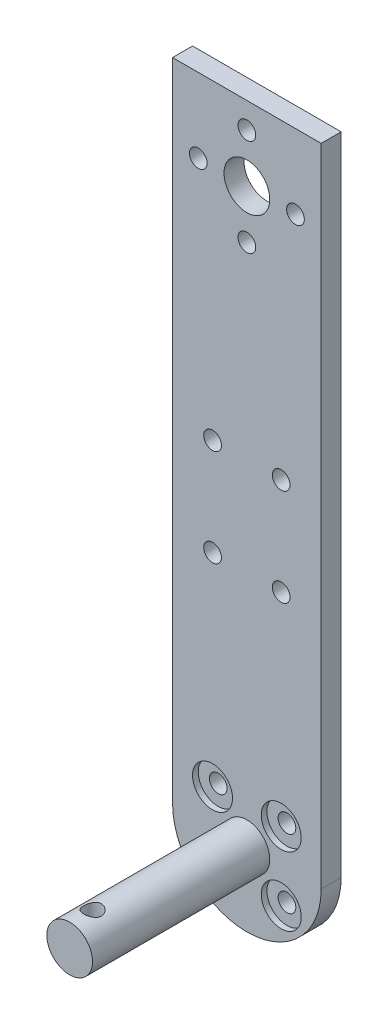
ISO-10303-21;
HEADER;
FILE_DESCRIPTION(('STEP AP214'),'2;1');
FILE_NAME('part.step','',(''),(''),'','','');
FILE_SCHEMA(('AUTOMOTIVE_DESIGN { 1 0 10303 214 1 1 1 1 }'));
ENDSEC;
DATA;
#1=APPLICATION_CONTEXT('core data for automotive mechanical design processes');
#2=APPLICATION_PROTOCOL_DEFINITION('international standard','automotive_design',2000,#1);
#3=PRODUCT_CONTEXT('',#1,'mechanical');
#4=PRODUCT('Part','Part','',(#3));
#5=PRODUCT_RELATED_PRODUCT_CATEGORY('part','',(#4));
#6=PRODUCT_DEFINITION_FORMATION('','',#4);
#7=PRODUCT_DEFINITION_CONTEXT('part definition',#1,'design');
#8=PRODUCT_DEFINITION('design','',#6,#7);
#9=PRODUCT_DEFINITION_SHAPE('','',#8);
#10=(LENGTH_UNIT() NAMED_UNIT(*) SI_UNIT(.MILLI.,.METRE.));
#11=(NAMED_UNIT(*) PLANE_ANGLE_UNIT() SI_UNIT($,.RADIAN.));
#12=(NAMED_UNIT(*) SI_UNIT($,.STERADIAN.) SOLID_ANGLE_UNIT());
#13=UNCERTAINTY_MEASURE_WITH_UNIT(LENGTH_MEASURE(1.E-05),#10,'distance_accuracy_value','');
#14=(GEOMETRIC_REPRESENTATION_CONTEXT(3) GLOBAL_UNCERTAINTY_ASSIGNED_CONTEXT((#13)) GLOBAL_UNIT_ASSIGNED_CONTEXT((#10,
#11,#12)) REPRESENTATION_CONTEXT('',''));
#15=CARTESIAN_POINT('',(0.,0.,0.));
#16=DIRECTION('',(0.,0.,1.));
#17=DIRECTION('',(1.,0.,0.));
#18=AXIS2_PLACEMENT_3D('',#15,#16,#17);
#19=CARTESIAN_POINT('',(6.01040764008564,6.01040764008567,3.5));
#20=DIRECTION('',(0.,0.,-1.));
#21=DIRECTION('',(-1.,0.,0.));
#22=AXIS2_PLACEMENT_3D('',#19,#20,#21);
#23=CYLINDRICAL_SURFACE('',#22,1.55);
#24=CARTESIAN_POINT('',(6.01040764008564,6.01040764008567,0.));
#25=DIRECTION('',(0.,0.,1.));
#26=DIRECTION('',(1.,0.,0.));
#27=AXIS2_PLACEMENT_3D('',#24,#25,#26);
#28=CIRCLE('',#27,1.55);
#29=CARTESIAN_POINT('',(7.56040764008564,6.01040764008567,0.));
#30=VERTEX_POINT('',#29);
#31=EDGE_CURVE('E109',#30,#30,#28,.T.);
#32=ORIENTED_EDGE('',*,*,#31,.F.);
#33=EDGE_LOOP('',(#32));
#34=FACE_BOUND('',#33,.T.);
#35=CARTESIAN_POINT('',(6.01040764008564,6.01040764008567,2.5));
#36=DIRECTION('',(0.,0.,1.));
#37=DIRECTION('',(1.,0.,0.));
#38=AXIS2_PLACEMENT_3D('',#35,#36,#37);
#39=CIRCLE('',#38,1.55);
#40=CARTESIAN_POINT('',(7.56040764008564,6.01040764008567,2.5));
#41=VERTEX_POINT('',#40);
#42=EDGE_CURVE('E40',#41,#41,#39,.T.);
#43=ORIENTED_EDGE('',*,*,#42,.T.);
#44=EDGE_LOOP('',(#43));
#45=FACE_BOUND('',#44,.T.);
#46=ADVANCED_FACE('F36',(#34,#45),#23,.F.);
#47=CARTESIAN_POINT('',(6.01040764008586,-6.01040764008564,3.5));
#48=DIRECTION('',(0.,0.,-1.));
#49=DIRECTION('',(-1.,0.,0.));
#50=AXIS2_PLACEMENT_3D('',#47,#48,#49);
#51=CYLINDRICAL_SURFACE('',#50,1.55);
#52=CARTESIAN_POINT('',(6.01040764008586,-6.01040764008564,0.));
#53=DIRECTION('',(0.,0.,1.));
#54=DIRECTION('',(1.,0.,0.));
#55=AXIS2_PLACEMENT_3D('',#52,#53,#54);
#56=CIRCLE('',#55,1.55);
#57=CARTESIAN_POINT('',(7.56040764008586,-6.01040764008564,0.));
#58=VERTEX_POINT('',#57);
#59=EDGE_CURVE('E192',#58,#58,#56,.T.);
#60=ORIENTED_EDGE('',*,*,#59,.F.);
#61=EDGE_LOOP('',(#60));
#62=FACE_BOUND('',#61,.T.);
#63=CARTESIAN_POINT('',(6.01040764008586,-6.01040764008564,2.5));
#64=DIRECTION('',(0.,0.,1.));
#65=DIRECTION('',(1.,0.,0.));
#66=AXIS2_PLACEMENT_3D('',#63,#64,#65);
#67=CIRCLE('',#66,1.55);
#68=CARTESIAN_POINT('',(7.56040764008586,-6.01040764008564,2.5));
#69=VERTEX_POINT('',#68);
#70=EDGE_CURVE('E122',#69,#69,#67,.T.);
#71=ORIENTED_EDGE('',*,*,#70,.T.);
#72=EDGE_LOOP('',(#71));
#73=FACE_BOUND('',#72,.T.);
#74=ADVANCED_FACE('F208',(#62,#73),#51,.F.);
#75=CARTESIAN_POINT('',(-6.01040764008545,-6.01040764008586,3.5));
#76=DIRECTION('',(0.,0.,-1.));
#77=DIRECTION('',(-1.,0.,0.));
#78=AXIS2_PLACEMENT_3D('',#75,#76,#77);
#79=CYLINDRICAL_SURFACE('',#78,1.55);
#80=CARTESIAN_POINT('',(-6.01040764008545,-6.01040764008586,0.));
#81=DIRECTION('',(0.,0.,1.));
#82=DIRECTION('',(1.,0.,0.));
#83=AXIS2_PLACEMENT_3D('',#80,#81,#82);
#84=CIRCLE('',#83,1.55);
#85=CARTESIAN_POINT('',(-4.46040764008545,-6.01040764008586,0.));
#86=VERTEX_POINT('',#85);
#87=EDGE_CURVE('E189',#86,#86,#84,.T.);
#88=ORIENTED_EDGE('',*,*,#87,.F.);
#89=EDGE_LOOP('',(#88));
#90=FACE_BOUND('',#89,.T.);
#91=CARTESIAN_POINT('',(-6.01040764008545,-6.01040764008586,2.5));
#92=DIRECTION('',(0.,0.,1.));
#93=DIRECTION('',(1.,0.,0.));
#94=AXIS2_PLACEMENT_3D('',#91,#92,#93);
#95=CIRCLE('',#94,1.55);
#96=CARTESIAN_POINT('',(-4.46040764008545,-6.01040764008586,2.5));
#97=VERTEX_POINT('',#96);
#98=EDGE_CURVE('E119',#97,#97,#95,.T.);
#99=ORIENTED_EDGE('',*,*,#98,.T.);
#100=EDGE_LOOP('',(#99));
#101=FACE_BOUND('',#100,.T.);
#102=ADVANCED_FACE('F213',(#90,#101),#79,.F.);
#103=CARTESIAN_POINT('',(-6.01040764008567,6.01040764008545,3.5));
#104=DIRECTION('',(0.,0.,-1.));
#105=DIRECTION('',(-1.,0.,0.));
#106=AXIS2_PLACEMENT_3D('',#103,#104,#105);
#107=CYLINDRICAL_SURFACE('',#106,1.55);
#108=CARTESIAN_POINT('',(-6.01040764008567,6.01040764008545,0.));
#109=DIRECTION('',(0.,0.,1.));
#110=DIRECTION('',(1.,0.,0.));
#111=AXIS2_PLACEMENT_3D('',#108,#109,#110);
#112=CIRCLE('',#111,1.55);
#113=CARTESIAN_POINT('',(-4.46040764008567,6.01040764008545,0.));
#114=VERTEX_POINT('',#113);
#115=EDGE_CURVE('E184',#114,#114,#112,.T.);
#116=ORIENTED_EDGE('',*,*,#115,.F.);
#117=EDGE_LOOP('',(#116));
#118=FACE_BOUND('',#117,.T.);
#119=CARTESIAN_POINT('',(-6.01040764008567,6.01040764008545,2.5));
#120=DIRECTION('',(0.,0.,1.));
#121=DIRECTION('',(1.,0.,0.));
#122=AXIS2_PLACEMENT_3D('',#119,#120,#121);
#123=CIRCLE('',#122,1.55);
#124=CARTESIAN_POINT('',(-4.46040764008567,6.01040764008545,2.5));
#125=VERTEX_POINT('',#124);
#126=EDGE_CURVE('E116',#125,#125,#123,.T.);
#127=ORIENTED_EDGE('',*,*,#126,.T.);
#128=EDGE_LOOP('',(#127));
#129=FACE_BOUND('',#128,.T.);
#130=ADVANCED_FACE('F221',(#118,#129),#107,.F.);
#131=CARTESIAN_POINT('',(0.,0.,3.5));
#132=DIRECTION('',(0.,0.,-1.));
#133=DIRECTION('',(-1.,0.,0.));
#134=AXIS2_PLACEMENT_3D('',#131,#132,#133);
#135=PLANE('',#134);
#136=CARTESIAN_POINT('',(-6.0104076400851,-6.01040764008567,3.5));
#137=DIRECTION('',(0.,0.,1.));
#138=DIRECTION('',(1.,0.,0.));
#139=AXIS2_PLACEMENT_3D('',#136,#137,#138);
#140=CIRCLE('',#139,3.50000000000018);
#141=CARTESIAN_POINT('',(-2.51040764008492,-6.01040764008567,3.5));
#142=VERTEX_POINT('',#141);
#143=EDGE_CURVE('E446',#142,#142,#140,.T.);
#144=ORIENTED_EDGE('',*,*,#143,.F.);
#145=EDGE_LOOP('',(#144));
#146=FACE_BOUND('',#145,.T.);
#147=CARTESIAN_POINT('',(6.01040764008601,-6.0104076400851,3.5));
#148=DIRECTION('',(0.,0.,1.));
#149=DIRECTION('',(1.,0.,0.));
#150=AXIS2_PLACEMENT_3D('',#147,#148,#149);
#151=CIRCLE('',#150,3.50000000000048);
#152=CARTESIAN_POINT('',(9.5104076400865,-6.0104076400851,3.5));
#153=VERTEX_POINT('',#152);
#154=EDGE_CURVE('E445',#153,#153,#151,.T.);
#155=ORIENTED_EDGE('',*,*,#154,.F.);
#156=EDGE_LOOP('',(#155));
#157=FACE_BOUND('',#156,.T.);
#158=CARTESIAN_POINT('',(6.01040764008545,6.01040764008601,3.5));
#159=DIRECTION('',(0.,0.,1.));
#160=DIRECTION('',(1.,0.,0.));
#161=AXIS2_PLACEMENT_3D('',#158,#159,#160);
#162=CIRCLE('',#161,3.50000000000036);
#163=CARTESIAN_POINT('',(9.5104076400858,6.01040764008601,3.5));
#164=VERTEX_POINT('',#163);
#165=EDGE_CURVE('E463',#164,#164,#162,.T.);
#166=ORIENTED_EDGE('',*,*,#165,.F.);
#167=EDGE_LOOP('',(#166));
#168=FACE_BOUND('',#167,.T.);
#169=CARTESIAN_POINT('',(-6.01040764008567,6.01040764008545,3.5));
#170=DIRECTION('',(0.,0.,1.));
#171=DIRECTION('',(1.,0.,0.));
#172=AXIS2_PLACEMENT_3D('',#169,#170,#171);
#173=CIRCLE('',#172,3.5);
#174=CARTESIAN_POINT('',(-2.51040764008567,6.01040764008545,3.5));
#175=VERTEX_POINT('',#174);
#176=EDGE_CURVE('E140',#175,#175,#173,.T.);
#177=ORIENTED_EDGE('',*,*,#176,.F.);
#178=EDGE_LOOP('',(#177));
#179=FACE_BOUND('',#178,.T.);
#180=CARTESIAN_POINT('',(0.,0.,3.5));
#181=DIRECTION('',(0.,0.,-1.));
#182=DIRECTION('',(-1.,0.,0.));
#183=AXIS2_PLACEMENT_3D('',#180,#181,#182);
#184=CIRCLE('',#183,4.);
#185=CARTESIAN_POINT('',(-4.,0.,3.5));
#186=VERTEX_POINT('',#185);
#187=EDGE_CURVE('E11',#186,#186,#184,.F.);
#188=ORIENTED_EDGE('',*,*,#187,.F.);
#189=EDGE_LOOP('',(#188));
#190=FACE_BOUND('',#189,.T.);
#191=CARTESIAN_POINT('',(0.,0.,3.5));
#192=DIRECTION('',(0.,0.,1.));
#193=DIRECTION('',(-1.,0.,0.));
#194=AXIS2_PLACEMENT_3D('',#191,#192,#193);
#195=CIRCLE('',#194,13.);
#196=CARTESIAN_POINT('',(-13.,0.,3.5));
#197=VERTEX_POINT('',#196);
#198=CARTESIAN_POINT('',(13.,0.,3.5));
#199=VERTEX_POINT('',#198);
#200=EDGE_CURVE('E92',#197,#199,#195,.T.);
#201=ORIENTED_EDGE('',*,*,#200,.T.);
#202=DIRECTION('',(0.,1.,0.));
#203=VECTOR('',#202,1.);
#204=CARTESIAN_POINT('',(13.,0.,3.5));
#205=LINE('',#204,#203);
#206=CARTESIAN_POINT('',(13.,113.,3.5));
#207=VERTEX_POINT('',#206);
#208=EDGE_CURVE('E86',#199,#207,#205,.T.);
#209=ORIENTED_EDGE('',*,*,#208,.T.);
#210=DIRECTION('',(-1.,0.,0.));
#211=VECTOR('',#210,1.);
#212=CARTESIAN_POINT('',(13.,113.,3.5));
#213=LINE('',#212,#211);
#214=CARTESIAN_POINT('',(-13.,113.,3.5));
#215=VERTEX_POINT('',#214);
#216=EDGE_CURVE('E90',#207,#215,#213,.T.);
#217=ORIENTED_EDGE('',*,*,#216,.T.);
#218=DIRECTION('',(0.,-1.,0.));
#219=VECTOR('',#218,1.);
#220=CARTESIAN_POINT('',(-13.,0.,3.5));
#221=LINE('',#220,#219);
#222=EDGE_CURVE('E55',#215,#197,#221,.T.);
#223=ORIENTED_EDGE('',*,*,#222,.T.);
#224=EDGE_LOOP('',(#201,#209,#217,#223));
#225=FACE_BOUND('',#224,.T.);
#226=CARTESIAN_POINT('',(0.,100.,3.5));
#227=DIRECTION('',(0.,0.,1.));
#228=DIRECTION('',(1.,0.,0.));
#229=AXIS2_PLACEMENT_3D('',#226,#227,#228);
#230=CIRCLE('',#229,4.);
#231=CARTESIAN_POINT('',(4.,100.,3.5));
#232=VERTEX_POINT('',#231);
#233=EDGE_CURVE('E196',#232,#232,#230,.T.);
#234=ORIENTED_EDGE('',*,*,#233,.F.);
#235=EDGE_LOOP('',(#234));
#236=FACE_BOUND('',#235,.T.);
#237=CARTESIAN_POINT('',(0.,108.5,3.5));
#238=DIRECTION('',(0.,0.,1.));
#239=DIRECTION('',(1.,0.,0.));
#240=AXIS2_PLACEMENT_3D('',#237,#238,#239);
#241=CIRCLE('',#240,1.55);
#242=CARTESIAN_POINT('',(1.55,108.5,3.5));
#243=VERTEX_POINT('',#242);
#244=EDGE_CURVE('E181',#243,#243,#241,.T.);
#245=ORIENTED_EDGE('',*,*,#244,.F.);
#246=EDGE_LOOP('',(#245));
#247=FACE_BOUND('',#246,.T.);
#248=CARTESIAN_POINT('',(6.,58.5,3.5));
#249=DIRECTION('',(0.,0.,1.));
#250=DIRECTION('',(1.,0.,0.));
#251=AXIS2_PLACEMENT_3D('',#248,#249,#250);
#252=CIRCLE('',#251,1.55);
#253=CARTESIAN_POINT('',(7.55,58.5,3.5));
#254=VERTEX_POINT('',#253);
#255=EDGE_CURVE('E175',#254,#254,#252,.T.);
#256=ORIENTED_EDGE('',*,*,#255,.F.);
#257=EDGE_LOOP('',(#256));
#258=FACE_BOUND('',#257,.T.);
#259=CARTESIAN_POINT('',(8.50000000000013,100.,3.5));
#260=DIRECTION('',(0.,0.,1.));
#261=DIRECTION('',(1.,0.,0.));
#262=AXIS2_PLACEMENT_3D('',#259,#260,#261);
#263=CIRCLE('',#262,1.55000000000001);
#264=CARTESIAN_POINT('',(10.0500000000001,100.,3.5));
#265=VERTEX_POINT('',#264);
#266=EDGE_CURVE('E169',#265,#265,#263,.T.);
#267=ORIENTED_EDGE('',*,*,#266,.F.);
#268=EDGE_LOOP('',(#267));
#269=FACE_BOUND('',#268,.T.);
#270=CARTESIAN_POINT('',(1.79106498060275E-13,91.5,3.5));
#271=DIRECTION('',(0.,0.,1.));
#272=DIRECTION('',(1.,0.,0.));
#273=AXIS2_PLACEMENT_3D('',#270,#271,#272);
#274=CIRCLE('',#273,1.55);
#275=CARTESIAN_POINT('',(1.55000000000018,91.5,3.5));
#276=VERTEX_POINT('',#275);
#277=EDGE_CURVE('E163',#276,#276,#274,.T.);
#278=ORIENTED_EDGE('',*,*,#277,.F.);
#279=EDGE_LOOP('',(#278));
#280=FACE_BOUND('',#279,.T.);
#281=CARTESIAN_POINT('',(-8.49999999999988,100.,3.5));
#282=DIRECTION('',(0.,0.,1.));
#283=DIRECTION('',(1.,0.,0.));
#284=AXIS2_PLACEMENT_3D('',#281,#282,#283);
#285=CIRCLE('',#284,1.55);
#286=CARTESIAN_POINT('',(-6.94999999999988,100.,3.5));
#287=VERTEX_POINT('',#286);
#288=EDGE_CURVE('E157',#287,#287,#285,.T.);
#289=ORIENTED_EDGE('',*,*,#288,.F.);
#290=EDGE_LOOP('',(#289));
#291=FACE_BOUND('',#290,.T.);
#292=CARTESIAN_POINT('',(6.,41.5,3.5));
#293=DIRECTION('',(0.,0.,1.));
#294=DIRECTION('',(1.,0.,0.));
#295=AXIS2_PLACEMENT_3D('',#292,#293,#294);
#296=CIRCLE('',#295,1.55);
#297=CARTESIAN_POINT('',(7.55,41.5,3.5));
#298=VERTEX_POINT('',#297);
#299=EDGE_CURVE('E151',#298,#298,#296,.T.);
#300=ORIENTED_EDGE('',*,*,#299,.F.);
#301=EDGE_LOOP('',(#300));
#302=FACE_BOUND('',#301,.T.);
#303=CARTESIAN_POINT('',(-6.,58.5,3.5));
#304=DIRECTION('',(0.,0.,1.));
#305=DIRECTION('',(-1.,0.,0.));
#306=AXIS2_PLACEMENT_3D('',#303,#304,#305);
#307=CIRCLE('',#306,1.55);
#308=CARTESIAN_POINT('',(-7.55,58.5,3.5));
#309=VERTEX_POINT('',#308);
#310=EDGE_CURVE('E145',#309,#309,#307,.T.);
#311=ORIENTED_EDGE('',*,*,#310,.F.);
#312=EDGE_LOOP('',(#311));
#313=FACE_BOUND('',#312,.T.);
#314=CARTESIAN_POINT('',(-6.,41.5,3.5));
#315=DIRECTION('',(0.,0.,1.));
#316=DIRECTION('',(-1.,0.,0.));
#317=AXIS2_PLACEMENT_3D('',#314,#315,#316);
#318=CIRCLE('',#317,1.55);
#319=CARTESIAN_POINT('',(-7.55,41.5,3.5));
#320=VERTEX_POINT('',#319);
#321=EDGE_CURVE('E136',#320,#320,#318,.T.);
#322=ORIENTED_EDGE('',*,*,#321,.F.);
#323=EDGE_LOOP('',(#322));
#324=FACE_BOUND('',#323,.T.);
#325=ADVANCED_FACE('F87',(#146,#157,#168,#179,#190,#225,#236,#247,#258,#269,#280,#291,#302,#313,
#324),#135,.F.);
#326=CARTESIAN_POINT('',(0.,0.,0.));
#327=DIRECTION('',(0.,0.,-1.));
#328=DIRECTION('',(-1.,0.,0.));
#329=AXIS2_PLACEMENT_3D('',#326,#327,#328);
#330=PLANE('',#329);
#331=CARTESIAN_POINT('',(-6.,58.5,0.));
#332=DIRECTION('',(0.,0.,1.));
#333=DIRECTION('',(-1.,0.,0.));
#334=AXIS2_PLACEMENT_3D('',#331,#332,#333);
#335=CIRCLE('',#334,1.55);
#336=CARTESIAN_POINT('',(-7.55,58.5,0.));
#337=VERTEX_POINT('',#336);
#338=EDGE_CURVE('E143',#337,#337,#335,.T.);
#339=ORIENTED_EDGE('',*,*,#338,.T.);
#340=EDGE_LOOP('',(#339));
#341=FACE_BOUND('',#340,.T.);
#342=CARTESIAN_POINT('',(-8.49999999999988,100.,0.));
#343=DIRECTION('',(0.,0.,1.));
#344=DIRECTION('',(1.,0.,0.));
#345=AXIS2_PLACEMENT_3D('',#342,#343,#344);
#346=CIRCLE('',#345,1.55);
#347=CARTESIAN_POINT('',(-6.94999999999988,100.,0.));
#348=VERTEX_POINT('',#347);
#349=EDGE_CURVE('E154',#348,#348,#346,.T.);
#350=ORIENTED_EDGE('',*,*,#349,.T.);
#351=EDGE_LOOP('',(#350));
#352=FACE_BOUND('',#351,.T.);
#353=CARTESIAN_POINT('',(8.50000000000013,100.,0.));
#354=DIRECTION('',(0.,0.,1.));
#355=DIRECTION('',(1.,0.,0.));
#356=AXIS2_PLACEMENT_3D('',#353,#354,#355);
#357=CIRCLE('',#356,1.55000000000001);
#358=CARTESIAN_POINT('',(10.0500000000001,100.,0.));
#359=VERTEX_POINT('',#358);
#360=EDGE_CURVE('E166',#359,#359,#357,.T.);
#361=ORIENTED_EDGE('',*,*,#360,.T.);
#362=EDGE_LOOP('',(#361));
#363=FACE_BOUND('',#362,.T.);
#364=CARTESIAN_POINT('',(0.,108.5,0.));
#365=DIRECTION('',(0.,0.,1.));
#366=DIRECTION('',(1.,0.,0.));
#367=AXIS2_PLACEMENT_3D('',#364,#365,#366);
#368=CIRCLE('',#367,1.55);
#369=CARTESIAN_POINT('',(1.55,108.5,0.));
#370=VERTEX_POINT('',#369);
#371=EDGE_CURVE('E178',#370,#370,#368,.T.);
#372=ORIENTED_EDGE('',*,*,#371,.T.);
#373=EDGE_LOOP('',(#372));
#374=FACE_BOUND('',#373,.T.);
#375=ORIENTED_EDGE('',*,*,#87,.T.);
#376=EDGE_LOOP('',(#375));
#377=FACE_BOUND('',#376,.T.);
#378=CARTESIAN_POINT('',(0.,100.,0.));
#379=DIRECTION('',(0.,0.,1.));
#380=DIRECTION('',(1.,0.,0.));
#381=AXIS2_PLACEMENT_3D('',#378,#379,#380);
#382=CIRCLE('',#381,4.);
#383=CARTESIAN_POINT('',(4.,100.,0.));
#384=VERTEX_POINT('',#383);
#385=EDGE_CURVE('E195',#384,#384,#382,.T.);
#386=ORIENTED_EDGE('',*,*,#385,.T.);
#387=EDGE_LOOP('',(#386));
#388=FACE_BOUND('',#387,.T.);
#389=CARTESIAN_POINT('',(0.,0.,0.));
#390=DIRECTION('',(0.,0.,1.));
#391=DIRECTION('',(-1.,0.,0.));
#392=AXIS2_PLACEMENT_3D('',#389,#390,#391);
#393=CIRCLE('',#392,13.);
#394=CARTESIAN_POINT('',(-13.,0.,0.));
#395=VERTEX_POINT('',#394);
#396=CARTESIAN_POINT('',(13.,0.,0.));
#397=VERTEX_POINT('',#396);
#398=EDGE_CURVE('E106',#395,#397,#393,.T.);
#399=ORIENTED_EDGE('',*,*,#398,.F.);
#400=DIRECTION('',(0.,-1.,0.));
#401=VECTOR('',#400,1.);
#402=CARTESIAN_POINT('',(-13.,0.,0.));
#403=LINE('',#402,#401);
#404=CARTESIAN_POINT('',(-13.,113.,0.));
#405=VERTEX_POINT('',#404);
#406=EDGE_CURVE('E78',#405,#395,#403,.T.);
#407=ORIENTED_EDGE('',*,*,#406,.F.);
#408=DIRECTION('',(-1.,0.,0.));
#409=VECTOR('',#408,1.);
#410=CARTESIAN_POINT('',(13.,113.,0.));
#411=LINE('',#410,#409);
#412=CARTESIAN_POINT('',(13.,113.,0.));
#413=VERTEX_POINT('',#412);
#414=EDGE_CURVE('E72',#413,#405,#411,.T.);
#415=ORIENTED_EDGE('',*,*,#414,.F.);
#416=DIRECTION('',(0.,1.,0.));
#417=VECTOR('',#416,1.);
#418=CARTESIAN_POINT('',(13.,0.,0.));
#419=LINE('',#418,#417);
#420=EDGE_CURVE('E97',#397,#413,#419,.T.);
#421=ORIENTED_EDGE('',*,*,#420,.F.);
#422=EDGE_LOOP('',(#399,#407,#415,#421));
#423=FACE_BOUND('',#422,.T.);
#424=ORIENTED_EDGE('',*,*,#31,.T.);
#425=EDGE_LOOP('',(#424));
#426=FACE_BOUND('',#425,.T.);
#427=ORIENTED_EDGE('',*,*,#59,.T.);
#428=EDGE_LOOP('',(#427));
#429=FACE_BOUND('',#428,.T.);
#430=ORIENTED_EDGE('',*,*,#115,.T.);
#431=EDGE_LOOP('',(#430));
#432=FACE_BOUND('',#431,.T.);
#433=CARTESIAN_POINT('',(6.,58.5,0.));
#434=DIRECTION('',(0.,0.,1.));
#435=DIRECTION('',(1.,0.,0.));
#436=AXIS2_PLACEMENT_3D('',#433,#434,#435);
#437=CIRCLE('',#436,1.55);
#438=CARTESIAN_POINT('',(7.55,58.5,0.));
#439=VERTEX_POINT('',#438);
#440=EDGE_CURVE('E172',#439,#439,#437,.T.);
#441=ORIENTED_EDGE('',*,*,#440,.T.);
#442=EDGE_LOOP('',(#441));
#443=FACE_BOUND('',#442,.T.);
#444=CARTESIAN_POINT('',(1.79106498060275E-13,91.5,0.));
#445=DIRECTION('',(0.,0.,1.));
#446=DIRECTION('',(1.,0.,0.));
#447=AXIS2_PLACEMENT_3D('',#444,#445,#446);
#448=CIRCLE('',#447,1.55);
#449=CARTESIAN_POINT('',(1.55000000000018,91.5,0.));
#450=VERTEX_POINT('',#449);
#451=EDGE_CURVE('E160',#450,#450,#448,.T.);
#452=ORIENTED_EDGE('',*,*,#451,.T.);
#453=EDGE_LOOP('',(#452));
#454=FACE_BOUND('',#453,.T.);
#455=CARTESIAN_POINT('',(6.,41.5,0.));
#456=DIRECTION('',(0.,0.,1.));
#457=DIRECTION('',(1.,0.,0.));
#458=AXIS2_PLACEMENT_3D('',#455,#456,#457);
#459=CIRCLE('',#458,1.55);
#460=CARTESIAN_POINT('',(7.55,41.5,0.));
#461=VERTEX_POINT('',#460);
#462=EDGE_CURVE('E148',#461,#461,#459,.T.);
#463=ORIENTED_EDGE('',*,*,#462,.T.);
#464=EDGE_LOOP('',(#463));
#465=FACE_BOUND('',#464,.T.);
#466=CARTESIAN_POINT('',(-6.,41.5,0.));
#467=DIRECTION('',(0.,0.,1.));
#468=DIRECTION('',(-1.,0.,0.));
#469=AXIS2_PLACEMENT_3D('',#466,#467,#468);
#470=CIRCLE('',#469,1.55);
#471=CARTESIAN_POINT('',(-7.55,41.5,0.));
#472=VERTEX_POINT('',#471);
#473=EDGE_CURVE('E131',#472,#472,#470,.T.);
#474=ORIENTED_EDGE('',*,*,#473,.T.);
#475=EDGE_LOOP('',(#474));
#476=FACE_BOUND('',#475,.T.);
#477=ADVANCED_FACE('F204',(#341,#352,#363,#374,#377,#388,#423,#426,#429,#432,#443,#454,#465,
#476),#330,.T.);
#478=CARTESIAN_POINT('',(0.,0.,3.5));
#479=DIRECTION('',(0.,0.,-1.));
#480=DIRECTION('',(-1.,0.,0.));
#481=AXIS2_PLACEMENT_3D('',#478,#479,#480);
#482=CYLINDRICAL_SURFACE('',#481,13.);
#483=ORIENTED_EDGE('',*,*,#398,.T.);
#484=DIRECTION('',(0.,0.,-1.));
#485=VECTOR('',#484,1.);
#486=CARTESIAN_POINT('',(13.,0.,3.5));
#487=LINE('',#486,#485);
#488=EDGE_CURVE('E46',#199,#397,#487,.T.);
#489=ORIENTED_EDGE('',*,*,#488,.F.);
#490=ORIENTED_EDGE('',*,*,#200,.F.);
#491=DIRECTION('',(0.,0.,-1.));
#492=VECTOR('',#491,1.);
#493=CARTESIAN_POINT('',(-13.,0.,3.5));
#494=LINE('',#493,#492);
#495=EDGE_CURVE('E102',#197,#395,#494,.T.);
#496=ORIENTED_EDGE('',*,*,#495,.T.);
#497=EDGE_LOOP('',(#483,#489,#490,#496));
#498=FACE_BOUND('',#497,.T.);
#499=ADVANCED_FACE('F38',(#498),#482,.T.);
#500=CARTESIAN_POINT('',(13.,0.,3.5));
#501=DIRECTION('',(-1.,0.,0.));
#502=DIRECTION('',(0.,0.,1.));
#503=AXIS2_PLACEMENT_3D('',#500,#501,#502);
#504=PLANE('',#503);
#505=ORIENTED_EDGE('',*,*,#420,.T.);
#506=DIRECTION('',(0.,0.,-1.));
#507=VECTOR('',#506,1.);
#508=CARTESIAN_POINT('',(13.,113.,3.5));
#509=LINE('',#508,#507);
#510=EDGE_CURVE('E95',#207,#413,#509,.T.);
#511=ORIENTED_EDGE('',*,*,#510,.F.);
#512=ORIENTED_EDGE('',*,*,#208,.F.);
#513=ORIENTED_EDGE('',*,*,#488,.T.);
#514=EDGE_LOOP('',(#505,#511,#512,#513));
#515=FACE_BOUND('',#514,.T.);
#516=ADVANCED_FACE('F96',(#515),#504,.F.);
#517=CARTESIAN_POINT('',(13.,113.,3.5));
#518=DIRECTION('',(0.,-1.,0.));
#519=DIRECTION('',(0.,0.,-1.));
#520=AXIS2_PLACEMENT_3D('',#517,#518,#519);
#521=PLANE('',#520);
#522=ORIENTED_EDGE('',*,*,#414,.T.);
#523=DIRECTION('',(0.,0.,-1.));
#524=VECTOR('',#523,1.);
#525=CARTESIAN_POINT('',(-13.,113.,3.5));
#526=LINE('',#525,#524);
#527=EDGE_CURVE('E98',#215,#405,#526,.T.);
#528=ORIENTED_EDGE('',*,*,#527,.F.);
#529=ORIENTED_EDGE('',*,*,#216,.F.);
#530=ORIENTED_EDGE('',*,*,#510,.T.);
#531=EDGE_LOOP('',(#522,#528,#529,#530));
#532=FACE_BOUND('',#531,.T.);
#533=ADVANCED_FACE('F100',(#532),#521,.F.);
#534=CARTESIAN_POINT('',(-13.,0.,3.5));
#535=DIRECTION('',(1.,0.,0.));
#536=DIRECTION('',(0.,0.,-1.));
#537=AXIS2_PLACEMENT_3D('',#534,#535,#536);
#538=PLANE('',#537);
#539=ORIENTED_EDGE('',*,*,#406,.T.);
#540=ORIENTED_EDGE('',*,*,#495,.F.);
#541=ORIENTED_EDGE('',*,*,#222,.F.);
#542=ORIENTED_EDGE('',*,*,#527,.T.);
#543=EDGE_LOOP('',(#539,#540,#541,#542));
#544=FACE_BOUND('',#543,.T.);
#545=ADVANCED_FACE('F226',(#544),#538,.F.);
#546=CARTESIAN_POINT('',(0.,100.,3.5));
#547=DIRECTION('',(0.,0.,-1.));
#548=DIRECTION('',(-1.,0.,0.));
#549=AXIS2_PLACEMENT_3D('',#546,#547,#548);
#550=CYLINDRICAL_SURFACE('',#549,4.);
#551=ORIENTED_EDGE('',*,*,#233,.T.);
#552=EDGE_LOOP('',(#551));
#553=FACE_BOUND('',#552,.T.);
#554=ORIENTED_EDGE('',*,*,#385,.F.);
#555=EDGE_LOOP('',(#554));
#556=FACE_BOUND('',#555,.T.);
#557=ADVANCED_FACE('F218',(#553,#556),#550,.F.);
#558=CARTESIAN_POINT('',(0.,108.5,3.5));
#559=DIRECTION('',(0.,0.,-1.));
#560=DIRECTION('',(-1.,0.,0.));
#561=AXIS2_PLACEMENT_3D('',#558,#559,#560);
#562=CYLINDRICAL_SURFACE('',#561,1.55);
#563=ORIENTED_EDGE('',*,*,#244,.T.);
#564=EDGE_LOOP('',(#563));
#565=FACE_BOUND('',#564,.T.);
#566=ORIENTED_EDGE('',*,*,#371,.F.);
#567=EDGE_LOOP('',(#566));
#568=FACE_BOUND('',#567,.T.);
#569=ADVANCED_FACE('F355',(#565,#568),#562,.F.);
#570=CARTESIAN_POINT('',(6.,58.5,3.5));
#571=DIRECTION('',(0.,0.,-1.));
#572=DIRECTION('',(-1.,0.,0.));
#573=AXIS2_PLACEMENT_3D('',#570,#571,#572);
#574=CYLINDRICAL_SURFACE('',#573,1.55);
#575=ORIENTED_EDGE('',*,*,#255,.T.);
#576=EDGE_LOOP('',(#575));
#577=FACE_BOUND('',#576,.T.);
#578=ORIENTED_EDGE('',*,*,#440,.F.);
#579=EDGE_LOOP('',(#578));
#580=FACE_BOUND('',#579,.T.);
#581=ADVANCED_FACE('F345',(#577,#580),#574,.F.);
#582=CARTESIAN_POINT('',(8.50000000000013,100.,3.5));
#583=DIRECTION('',(0.,0.,-1.));
#584=DIRECTION('',(-1.,0.,0.));
#585=AXIS2_PLACEMENT_3D('',#582,#583,#584);
#586=CYLINDRICAL_SURFACE('',#585,1.55000000000001);
#587=ORIENTED_EDGE('',*,*,#266,.T.);
#588=EDGE_LOOP('',(#587));
#589=FACE_BOUND('',#588,.T.);
#590=ORIENTED_EDGE('',*,*,#360,.F.);
#591=EDGE_LOOP('',(#590));
#592=FACE_BOUND('',#591,.T.);
#593=ADVANCED_FACE('F335',(#589,#592),#586,.F.);
#594=CARTESIAN_POINT('',(1.79106498060275E-13,91.5,3.5));
#595=DIRECTION('',(0.,0.,-1.));
#596=DIRECTION('',(-1.,0.,0.));
#597=AXIS2_PLACEMENT_3D('',#594,#595,#596);
#598=CYLINDRICAL_SURFACE('',#597,1.55);
#599=ORIENTED_EDGE('',*,*,#277,.T.);
#600=EDGE_LOOP('',(#599));
#601=FACE_BOUND('',#600,.T.);
#602=ORIENTED_EDGE('',*,*,#451,.F.);
#603=EDGE_LOOP('',(#602));
#604=FACE_BOUND('',#603,.T.);
#605=ADVANCED_FACE('F325',(#601,#604),#598,.F.);
#606=CARTESIAN_POINT('',(-8.49999999999988,100.,3.5));
#607=DIRECTION('',(0.,0.,-1.));
#608=DIRECTION('',(-1.,0.,0.));
#609=AXIS2_PLACEMENT_3D('',#606,#607,#608);
#610=CYLINDRICAL_SURFACE('',#609,1.55);
#611=ORIENTED_EDGE('',*,*,#288,.T.);
#612=EDGE_LOOP('',(#611));
#613=FACE_BOUND('',#612,.T.);
#614=ORIENTED_EDGE('',*,*,#349,.F.);
#615=EDGE_LOOP('',(#614));
#616=FACE_BOUND('',#615,.T.);
#617=ADVANCED_FACE('F315',(#613,#616),#610,.F.);
#618=CARTESIAN_POINT('',(6.,41.5,3.5));
#619=DIRECTION('',(0.,0.,-1.));
#620=DIRECTION('',(-1.,0.,0.));
#621=AXIS2_PLACEMENT_3D('',#618,#619,#620);
#622=CYLINDRICAL_SURFACE('',#621,1.55);
#623=ORIENTED_EDGE('',*,*,#299,.T.);
#624=EDGE_LOOP('',(#623));
#625=FACE_BOUND('',#624,.T.);
#626=ORIENTED_EDGE('',*,*,#462,.F.);
#627=EDGE_LOOP('',(#626));
#628=FACE_BOUND('',#627,.T.);
#629=ADVANCED_FACE('F305',(#625,#628),#622,.F.);
#630=CARTESIAN_POINT('',(-6.,58.5,3.5));
#631=DIRECTION('',(0.,0.,-1.));
#632=DIRECTION('',(-1.,0.,0.));
#633=AXIS2_PLACEMENT_3D('',#630,#631,#632);
#634=CYLINDRICAL_SURFACE('',#633,1.55);
#635=ORIENTED_EDGE('',*,*,#310,.T.);
#636=EDGE_LOOP('',(#635));
#637=FACE_BOUND('',#636,.T.);
#638=ORIENTED_EDGE('',*,*,#338,.F.);
#639=EDGE_LOOP('',(#638));
#640=FACE_BOUND('',#639,.T.);
#641=ADVANCED_FACE('F295',(#637,#640),#634,.F.);
#642=CARTESIAN_POINT('',(-6.,41.5,3.5));
#643=DIRECTION('',(0.,0.,-1.));
#644=DIRECTION('',(-1.,0.,0.));
#645=AXIS2_PLACEMENT_3D('',#642,#643,#644);
#646=CYLINDRICAL_SURFACE('',#645,1.55);
#647=ORIENTED_EDGE('',*,*,#321,.T.);
#648=EDGE_LOOP('',(#647));
#649=FACE_BOUND('',#648,.T.);
#650=ORIENTED_EDGE('',*,*,#473,.F.);
#651=EDGE_LOOP('',(#650));
#652=FACE_BOUND('',#651,.T.);
#653=ADVANCED_FACE('F290',(#649,#652),#646,.F.);
#654=CARTESIAN_POINT('',(0.,0.,34.5));
#655=DIRECTION('',(0.,0.,-1.));
#656=DIRECTION('',(-1.,0.,0.));
#657=AXIS2_PLACEMENT_3D('',#654,#655,#656);
#658=CYLINDRICAL_SURFACE('',#657,4.);
#659=CARTESIAN_POINT('',(0.,4.,28.95));
#660=CARTESIAN_POINT('',(-0.083741817010569,4.00000307103966,28.9499959912669));
#661=CARTESIAN_POINT('',(-0.167457172373491,3.9973478314409,28.9568073370164));
#662=CARTESIAN_POINT('',(-0.332375207740031,3.98702237503302,28.9837535651346));
#663=CARTESIAN_POINT('',(-0.413578428549001,3.97935324557983,29.0038855586827));
#664=CARTESIAN_POINT('',(-0.571068953775956,3.95981985493208,29.0566468806909));
#665=CARTESIAN_POINT('',(-0.647365774547911,3.94796402326925,29.0892511083804));
#666=CARTESIAN_POINT('',(-0.793397990414401,3.92122905980691,29.1658992097388));
#667=CARTESIAN_POINT('',(-0.863131499694836,3.9063490629407,29.2099463576765));
#668=CARTESIAN_POINT('',(-0.997188457700875,3.87434611173221,29.310291412028));
#669=CARTESIAN_POINT('',(-1.06117882783833,3.85715676295881,29.3670129043513));
#670=CARTESIAN_POINT('',(-1.17901131840263,3.8227877755339,29.4901972993996));
#671=CARTESIAN_POINT('',(-1.23285001917138,3.80560814209105,29.5566634713313));
#672=CARTESIAN_POINT('',(-1.33104129410194,3.77241707577086,29.7007885546201));
#673=CARTESIAN_POINT('',(-1.37491107737843,3.75648304078581,29.7787960202178));
#674=CARTESIAN_POINT('',(-1.44875905604123,3.72862797876421,29.9417951377925));
#675=CARTESIAN_POINT('',(-1.47874322896952,3.71670522553815,30.0267837659002));
#676=CARTESIAN_POINT('',(-1.52263359505666,3.69893619719526,30.1974891860112));
#677=CARTESIAN_POINT('',(-1.53717845025292,3.69284964987085,30.2830158816512));
#678=CARTESIAN_POINT('',(-1.55177347407324,3.686742208991,30.4554960385706));
#679=CARTESIAN_POINT('',(-1.55183016225289,3.6867185871691,30.5424488404975));
#680=CARTESIAN_POINT('',(-1.53793335557094,3.69253360906918,30.7093281950036));
#681=CARTESIAN_POINT('',(-1.52488463668497,3.69799366796117,30.789345788942));
#682=CARTESIAN_POINT('',(-1.48664952044108,3.71352858031644,30.9459514443488));
#683=CARTESIAN_POINT('',(-1.46146116614316,3.72360417780325,31.022538950702));
#684=CARTESIAN_POINT('',(-1.39919376657936,3.74745019933858,31.1718880912394));
#685=CARTESIAN_POINT('',(-1.36189037494605,3.76128946343745,31.2445447113113));
#686=CARTESIAN_POINT('',(-1.27660867855489,3.79108253096821,31.3828221029891));
#687=CARTESIAN_POINT('',(-1.22862651830679,3.80703709727107,31.4484403207197));
#688=CARTESIAN_POINT('',(-1.1192765867249,3.84066621512758,31.5757594849997));
#689=CARTESIAN_POINT('',(-1.057192826939,3.85838181074214,31.6368362299683));
#690=CARTESIAN_POINT('',(-0.923467184299236,3.89255270828944,31.7479039907166));
#691=CARTESIAN_POINT('',(-0.851823630229681,3.90900778906909,31.7978930641043));
#692=CARTESIAN_POINT('',(-0.699332321527975,3.93917140871768,31.8861183716676));
#693=CARTESIAN_POINT('',(-0.618345361125559,3.95282680746144,31.9241334745914));
#694=CARTESIAN_POINT('',(-0.450463577524194,3.97545468791428,31.9857887686004));
#695=CARTESIAN_POINT('',(-0.363571585538856,3.98442939616063,32.0094357952583));
#696=CARTESIAN_POINT('',(-0.191589310536436,3.99628616226532,32.0404530006203));
#697=CARTESIAN_POINT('',(-0.106672001209169,3.99948214473611,32.0486628854415));
#698=CARTESIAN_POINT('',(0.0633780229217728,4.0004007065522,32.0510347826259));
#699=CARTESIAN_POINT('',(0.148510681164302,3.99812459874478,32.0452001645032));
#700=CARTESIAN_POINT('',(0.312858974622367,3.98856115851297,32.0202769681641));
#701=CARTESIAN_POINT('',(0.392173433269956,3.98148622105735,32.0017498230045));
#702=CARTESIAN_POINT('',(0.54650371536322,3.96325324682584,31.9527188621209));
#703=CARTESIAN_POINT('',(0.621518980627425,3.95209468123897,31.9222134952352));
#704=CARTESIAN_POINT('',(0.767652849526814,3.92637006174119,31.8491052490632));
#705=CARTESIAN_POINT('',(0.838586587400794,3.91171167856455,31.8061663467448));
#706=CARTESIAN_POINT('',(0.972485884255145,3.88059327622918,31.7097860587091));
#707=CARTESIAN_POINT('',(1.03544835343258,3.86413256303816,31.6563406208415));
#708=CARTESIAN_POINT('',(1.15570630052789,3.82994670072776,31.5365723031989));
#709=CARTESIAN_POINT('',(1.21240855982172,3.81220642219352,31.4696565417085));
#710=CARTESIAN_POINT('',(1.31391042842011,3.7784267775271,31.3269269853336));
#711=CARTESIAN_POINT('',(1.35870855493064,3.76238762343854,31.2511120836549));
#712=CARTESIAN_POINT('',(1.43528626427411,3.73385097634257,31.0918671555308));
#713=CARTESIAN_POINT('',(1.46697619056479,3.72137804867911,31.008389307021));
#714=CARTESIAN_POINT('',(1.51562246992129,3.70183589219826,30.8366581746143));
#715=CARTESIAN_POINT('',(1.53258879385556,3.69476300684656,30.7484081655293));
#716=CARTESIAN_POINT('',(1.55038415337445,3.68732874278393,30.5761139440912));
#717=CARTESIAN_POINT('',(1.55223359693949,3.68654305278754,30.4921926662731));
#718=CARTESIAN_POINT('',(1.54238929517269,3.69067248938598,30.3252993720319));
#719=CARTESIAN_POINT('',(1.53069702502093,3.69558699502441,30.2423272532053));
#720=CARTESIAN_POINT('',(1.49491544189353,3.71019928004619,30.0826341038896));
#721=CARTESIAN_POINT('',(1.47127191862499,3.7197245672776,30.0057960104313));
#722=CARTESIAN_POINT('',(1.41266354169453,3.74237408260303,29.8571392320299));
#723=CARTESIAN_POINT('',(1.37769573935542,3.7554992479164,29.785321860338));
#724=CARTESIAN_POINT('',(1.29520837732455,3.7847652300439,29.6444543844358));
#725=CARTESIAN_POINT('',(1.24710518862183,3.80103203424639,29.5757725769274));
#726=CARTESIAN_POINT('',(1.1405907131212,3.83434014261162,29.4471315013078));
#727=CARTESIAN_POINT('',(1.0821760402714,3.85138169981626,29.3871751102561));
#728=CARTESIAN_POINT('',(0.952559682216135,3.88553398671661,29.2740486026689));
#729=CARTESIAN_POINT('',(0.880804909103494,3.90258881429735,29.221492300489));
#730=CARTESIAN_POINT('',(0.728878495223061,3.93379551376096,29.1291833822372));
#731=CARTESIAN_POINT('',(0.648705209225491,3.94794681660584,29.0894332750778));
#732=CARTESIAN_POINT('',(0.476070144268086,3.97259068830064,29.021809120905));
#733=CARTESIAN_POINT('',(0.383139212843735,3.9827464734198,28.9949961978748));
#734=CARTESIAN_POINT('',(0.193458883629426,3.99644738728565,28.9590992319309));
#735=CARTESIAN_POINT('',(0.0967117952157194,3.99999645331605,28.9500046296079));
#736=CARTESIAN_POINT('',(0.,4.,28.95));
#737=B_SPLINE_CURVE_WITH_KNOTS('',3,(#659,#660,#661,#662,#663,#664,#665,#666,#667,#668,#669,
#670,#671,#672,#673,#674,#675,#676,#677,#678,#679,#680,#681,#682,#683,#684,#685,#686,#687,#688,
#689,#690,#691,#692,#693,#694,#695,#696,#697,#698,#699,#700,#701,#702,#703,#704,#705,#706,#707,
#708,#709,#710,#711,#712,#713,#714,#715,#716,#717,#718,#719,#720,#721,#722,#723,#724,#725,#726,
#727,#728,#729,#730,#731,#732,#733,#734,#735,#736),.UNSPECIFIED.,.T.,.F.,(4,2,2,2,2,2,2,2,2,2,2,
2,2,2,2,2,2,2,2,2,2,2,2,2,2,2,2,2,2,2,2,2,2,2,2,2,2,2,4),(0.,0.250868506659481,
0.501682625822802,0.75199460680486,1.00237829091529,1.26289324584922,1.52349580083105,
1.79484593304448,2.06607914435898,2.32559405583375,2.58499218753424,2.82763403872305,
3.07031501748275,3.31777403042841,3.56532253197279,3.83073141369117,4.09618675436141,
4.36629046146055,4.63626556664624,4.89107530662835,5.14582391953312,5.38997552487788,
5.63415875792244,5.88568062986167,6.13729969950348,6.40451611555107,6.6717658008318,
6.94081432578583,7.2096805077575,7.4602341445683,7.71076048963592,7.95256448228418,
8.19443148785927,8.44957507206158,8.70480259588001,8.97517525206179,9.245600845856,
9.53549682269165,9.8252199802279),.UNSPECIFIED.);
#738=CARTESIAN_POINT('',(0.,4.,28.95));
#739=VERTEX_POINT('',#738);
#740=EDGE_CURVE('E452',#739,#739,#737,.T.);
#741=ORIENTED_EDGE('',*,*,#740,.F.);
#742=EDGE_LOOP('',(#741));
#743=FACE_BOUND('',#742,.T.);
#744=CARTESIAN_POINT('',(0.,-4.,32.05));
#745=CARTESIAN_POINT('',(0.0837418170105691,-4.00000307103966,32.0500040087332));
#746=CARTESIAN_POINT('',(0.167457172373491,-3.9973478314409,32.0431926629836));
#747=CARTESIAN_POINT('',(0.332375207740032,-3.98702237503302,32.0162464348654));
#748=CARTESIAN_POINT('',(0.413578428549002,-3.97935324557983,31.9961144413173));
#749=CARTESIAN_POINT('',(0.571068953775958,-3.95981985493208,31.9433531193091));
#750=CARTESIAN_POINT('',(0.647365774547913,-3.94796402326925,31.9107488916196));
#751=CARTESIAN_POINT('',(0.793397990414404,-3.92122905980691,31.8341007902612));
#752=CARTESIAN_POINT('',(0.86313149969484,-3.9063490629407,31.7900536423235));
#753=CARTESIAN_POINT('',(0.997188457700877,-3.8743461117322,31.689708587972));
#754=CARTESIAN_POINT('',(1.06117882783833,-3.85715676295881,31.6329870956487));
#755=CARTESIAN_POINT('',(1.17901131840263,-3.8227877755339,31.5098027006004));
#756=CARTESIAN_POINT('',(1.23285001917138,-3.80560814209105,31.4433365286687));
#757=CARTESIAN_POINT('',(1.33104129410195,-3.77241707577085,31.2992114453799));
#758=CARTESIAN_POINT('',(1.37491107737843,-3.75648304078581,31.2212039797822));
#759=CARTESIAN_POINT('',(1.44875905604124,-3.7286279787642,31.0582048622075));
#760=CARTESIAN_POINT('',(1.47874322896952,-3.71670522553815,30.9732162340998));
#761=CARTESIAN_POINT('',(1.52263359505666,-3.69893619719526,30.8025108139888));
#762=CARTESIAN_POINT('',(1.53717845025292,-3.69284964987085,30.7169841183488));
#763=CARTESIAN_POINT('',(1.55177347407324,-3.686742208991,30.5445039614294));
#764=CARTESIAN_POINT('',(1.55183016225289,-3.6867185871691,30.4575511595025));
#765=CARTESIAN_POINT('',(1.53793335557094,-3.69253360906918,30.2906718049964));
#766=CARTESIAN_POINT('',(1.52488463668497,-3.69799366796117,30.210654211058));
#767=CARTESIAN_POINT('',(1.48664952044108,-3.71352858031644,30.0540485556512));
#768=CARTESIAN_POINT('',(1.46146116614316,-3.72360417780325,29.977461049298));
#769=CARTESIAN_POINT('',(1.39919376657936,-3.74745019933858,29.8281119087606));
#770=CARTESIAN_POINT('',(1.36189037494605,-3.76128946343745,29.7554552886887));
#771=CARTESIAN_POINT('',(1.27660867855489,-3.79108253096821,29.6171778970109));
#772=CARTESIAN_POINT('',(1.22862651830679,-3.80703709727107,29.5515596792803));
#773=CARTESIAN_POINT('',(1.1192765867249,-3.84066621512758,29.4242405150004));
#774=CARTESIAN_POINT('',(1.05719282693901,-3.85838181074214,29.3631637700317));
#775=CARTESIAN_POINT('',(0.923467184299237,-3.89255270828944,29.2520960092834));
#776=CARTESIAN_POINT('',(0.851823630229684,-3.90900778906909,29.2021069358957));
#777=CARTESIAN_POINT('',(0.699332321527981,-3.93917140871768,29.1138816283324));
#778=CARTESIAN_POINT('',(0.618345361125565,-3.95282680746144,29.0758665254086));
#779=CARTESIAN_POINT('',(0.450463577524199,-3.97545468791428,29.0142112313996));
#780=CARTESIAN_POINT('',(0.363571585538861,-3.98442939616062,28.9905642047417));
#781=CARTESIAN_POINT('',(0.19158931053644,-3.99628616226532,28.9595469993797));
#782=CARTESIAN_POINT('',(0.106672001209174,-3.99948214473611,28.9513371145585));
#783=CARTESIAN_POINT('',(-0.0633780229217704,-4.0004007065522,28.9489652173741));
#784=CARTESIAN_POINT('',(-0.148510681164301,-3.99812459874478,28.9547998354968));
#785=CARTESIAN_POINT('',(-0.312858974622367,-3.98856115851297,28.9797230318359));
#786=CARTESIAN_POINT('',(-0.392173433269956,-3.98148622105735,28.9982501769955));
#787=CARTESIAN_POINT('',(-0.546503715363221,-3.96325324682584,29.0472811378791));
#788=CARTESIAN_POINT('',(-0.621518980627427,-3.95209468123897,29.0777865047648));
#789=CARTESIAN_POINT('',(-0.767652849526816,-3.92637006174119,29.1508947509368));
#790=CARTESIAN_POINT('',(-0.838586587400796,-3.91171167856455,29.1938336532552));
#791=CARTESIAN_POINT('',(-0.972485884255149,-3.88059327622918,29.2902139412909));
#792=CARTESIAN_POINT('',(-1.03544835343258,-3.86413256303816,29.3436593791585));
#793=CARTESIAN_POINT('',(-1.15570630052789,-3.82994670072776,29.4634276968011));
#794=CARTESIAN_POINT('',(-1.21240855982172,-3.81220642219352,29.5303434582915));
#795=CARTESIAN_POINT('',(-1.31391042842011,-3.7784267775271,29.6730730146664));
#796=CARTESIAN_POINT('',(-1.35870855493065,-3.76238762343853,29.7488879163451));
#797=CARTESIAN_POINT('',(-1.43528626427412,-3.73385097634257,29.9081328444692));
#798=CARTESIAN_POINT('',(-1.46697619056479,-3.72137804867911,29.991610692979));
#799=CARTESIAN_POINT('',(-1.51562246992129,-3.70183589219826,30.1633418253857));
#800=CARTESIAN_POINT('',(-1.53258879385556,-3.69476300684656,30.2515918344707));
#801=CARTESIAN_POINT('',(-1.55038415337445,-3.68732874278393,30.4238860559089));
#802=CARTESIAN_POINT('',(-1.55223359693949,-3.68654305278754,30.5078073337269));
#803=CARTESIAN_POINT('',(-1.54238929517269,-3.69067248938598,30.6747006279682));
#804=CARTESIAN_POINT('',(-1.53069702502093,-3.69558699502441,30.7576727467947));
#805=CARTESIAN_POINT('',(-1.49491544189353,-3.71019928004619,30.9173658961104));
#806=CARTESIAN_POINT('',(-1.47127191862499,-3.7197245672776,30.9942039895688));
#807=CARTESIAN_POINT('',(-1.41266354169454,-3.74237408260303,31.1428607679701));
#808=CARTESIAN_POINT('',(-1.37769573935542,-3.7554992479164,31.214678139662));
#809=CARTESIAN_POINT('',(-1.29520837732455,-3.7847652300439,31.3555456155642));
#810=CARTESIAN_POINT('',(-1.24710518862183,-3.80103203424639,31.4242274230726));
#811=CARTESIAN_POINT('',(-1.1405907131212,-3.83434014261162,31.5528684986922));
#812=CARTESIAN_POINT('',(-1.08217604027141,-3.85138169981625,31.6128248897439));
#813=CARTESIAN_POINT('',(-0.95255968221614,-3.88553398671661,31.7259513973311));
#814=CARTESIAN_POINT('',(-0.880804909103499,-3.90258881429735,31.778507699511));
#815=CARTESIAN_POINT('',(-0.728878495223067,-3.93379551376096,31.8708166177628));
#816=CARTESIAN_POINT('',(-0.648705209225497,-3.94794681660584,31.9105667249222));
#817=CARTESIAN_POINT('',(-0.476070144268091,-3.97259068830064,31.978190879095));
#818=CARTESIAN_POINT('',(-0.383139212843739,-3.98274647341979,32.0050038021252));
#819=CARTESIAN_POINT('',(-0.193458883629429,-3.99644738728565,32.0409007680692));
#820=CARTESIAN_POINT('',(-0.0967117952157209,-3.99999645331605,32.0499953703921));
#821=CARTESIAN_POINT('',(0.,-4.,32.05));
#822=B_SPLINE_CURVE_WITH_KNOTS('',3,(#744,#745,#746,#747,#748,#749,#750,#751,#752,#753,#754,
#755,#756,#757,#758,#759,#760,#761,#762,#763,#764,#765,#766,#767,#768,#769,#770,#771,#772,#773,
#774,#775,#776,#777,#778,#779,#780,#781,#782,#783,#784,#785,#786,#787,#788,#789,#790,#791,#792,
#793,#794,#795,#796,#797,#798,#799,#800,#801,#802,#803,#804,#805,#806,#807,#808,#809,#810,#811,
#812,#813,#814,#815,#816,#817,#818,#819,#820,#821),.UNSPECIFIED.,.T.,.F.,(4,2,2,2,2,2,2,2,2,2,2,
2,2,2,2,2,2,2,2,2,2,2,2,2,2,2,2,2,2,2,2,2,2,2,2,2,2,2,4),(0.,0.250868506659482,
0.501682625822804,0.751994606804861,1.00237829091529,1.26289324584922,1.52349580083106,
1.79484593304449,2.06607914435898,2.32559405583375,2.58499218753425,2.82763403872306,
3.07031501748275,3.31777403042841,3.56532253197278,3.83073141369117,4.0961867543614,
4.36629046146055,4.63626556664623,4.89107530662835,5.14582391953312,5.38997552487788,
5.63415875792245,5.88568062986167,6.13729969950349,6.40451611555109,6.6717658008318,
6.94081432578583,7.2096805077575,7.4602341445683,7.71076048963592,7.95256448228417,
8.19443148785927,8.44957507206157,8.70480259588,8.97517525206179,9.24560084585599,
9.53549682269165,9.8252199802279),.UNSPECIFIED.);
#823=CARTESIAN_POINT('',(0.,-4.,32.05));
#824=VERTEX_POINT('',#823);
#825=EDGE_CURVE('E526',#824,#824,#822,.T.);
#826=ORIENTED_EDGE('',*,*,#825,.T.);
#827=EDGE_LOOP('',(#826));
#828=FACE_BOUND('',#827,.T.);
#829=CARTESIAN_POINT('',(0.,0.,34.5));
#830=DIRECTION('',(0.,0.,1.));
#831=DIRECTION('',(1.,0.,0.));
#832=AXIS2_PLACEMENT_3D('',#829,#830,#831);
#833=CIRCLE('',#832,4.);
#834=CARTESIAN_POINT('',(4.,0.,34.5));
#835=VERTEX_POINT('',#834);
#836=EDGE_CURVE('E127',#835,#835,#833,.T.);
#837=ORIENTED_EDGE('',*,*,#836,.F.);
#838=EDGE_LOOP('',(#837));
#839=FACE_BOUND('',#838,.T.);
#840=ORIENTED_EDGE('',*,*,#187,.T.);
#841=EDGE_LOOP('',(#840));
#842=FACE_BOUND('',#841,.T.);
#843=ADVANCED_FACE('F282',(#743,#828,#839,#842),#658,.T.);
#844=CARTESIAN_POINT('',(0.,0.,34.5));
#845=DIRECTION('',(0.,0.,1.));
#846=DIRECTION('',(1.,0.,0.));
#847=AXIS2_PLACEMENT_3D('',#844,#845,#846);
#848=PLANE('',#847);
#849=ORIENTED_EDGE('',*,*,#836,.T.);
#850=EDGE_LOOP('',(#849));
#851=FACE_BOUND('',#850,.T.);
#852=ADVANCED_FACE('F276',(#851),#848,.T.);
#853=CARTESIAN_POINT('',(-6.01040764008567,6.01040764008545,2.5));
#854=DIRECTION('',(0.,0.,1.));
#855=DIRECTION('',(1.,0.,0.));
#856=AXIS2_PLACEMENT_3D('',#853,#854,#855);
#857=CYLINDRICAL_SURFACE('',#856,3.5);
#858=CARTESIAN_POINT('',(-6.01040764008567,6.01040764008545,2.5));
#859=DIRECTION('',(0.,0.,1.));
#860=DIRECTION('',(1.,0.,0.));
#861=AXIS2_PLACEMENT_3D('',#858,#859,#860);
#862=CIRCLE('',#861,3.5);
#863=CARTESIAN_POINT('',(-2.51040764008567,6.01040764008545,2.5));
#864=VERTEX_POINT('',#863);
#865=EDGE_CURVE('E120',#864,#864,#862,.T.);
#866=ORIENTED_EDGE('',*,*,#865,.F.);
#867=EDGE_LOOP('',(#866));
#868=FACE_BOUND('',#867,.T.);
#869=ORIENTED_EDGE('',*,*,#176,.T.);
#870=EDGE_LOOP('',(#869));
#871=FACE_BOUND('',#870,.T.);
#872=ADVANCED_FACE('F281',(#868,#871),#857,.F.);
#873=CARTESIAN_POINT('',(-6.01040764008567,6.01040764008545,2.5));
#874=DIRECTION('',(0.,0.,1.));
#875=DIRECTION('',(1.,0.,0.));
#876=AXIS2_PLACEMENT_3D('',#873,#874,#875);
#877=PLANE('',#876);
#878=ORIENTED_EDGE('',*,*,#126,.F.);
#879=EDGE_LOOP('',(#878));
#880=FACE_BOUND('',#879,.T.);
#881=ORIENTED_EDGE('',*,*,#865,.T.);
#882=EDGE_LOOP('',(#881));
#883=FACE_BOUND('',#882,.T.);
#884=ADVANCED_FACE('F500',(#880,#883),#877,.T.);
#885=CARTESIAN_POINT('',(-6.0104076400851,-6.01040764008567,2.5));
#886=DIRECTION('',(0.,0.,1.));
#887=DIRECTION('',(1.,0.,0.));
#888=AXIS2_PLACEMENT_3D('',#885,#886,#887);
#889=CYLINDRICAL_SURFACE('',#888,3.50000000000018);
#890=CARTESIAN_POINT('',(-6.0104076400851,-6.01040764008567,2.5));
#891=DIRECTION('',(0.,0.,1.));
#892=DIRECTION('',(1.,0.,0.));
#893=AXIS2_PLACEMENT_3D('',#890,#891,#892);
#894=CIRCLE('',#893,3.50000000000018);
#895=CARTESIAN_POINT('',(-2.51040764008492,-6.01040764008567,2.5));
#896=VERTEX_POINT('',#895);
#897=EDGE_CURVE('E443',#896,#896,#894,.T.);
#898=ORIENTED_EDGE('',*,*,#897,.F.);
#899=EDGE_LOOP('',(#898));
#900=FACE_BOUND('',#899,.T.);
#901=ORIENTED_EDGE('',*,*,#143,.T.);
#902=EDGE_LOOP('',(#901));
#903=FACE_BOUND('',#902,.T.);
#904=ADVANCED_FACE('F439',(#900,#903),#889,.F.);
#905=CARTESIAN_POINT('',(-6.0104076400851,-6.01040764008567,2.5));
#906=DIRECTION('',(0.,0.,1.));
#907=DIRECTION('',(1.,0.,0.));
#908=AXIS2_PLACEMENT_3D('',#905,#906,#907);
#909=PLANE('',#908);
#910=ORIENTED_EDGE('',*,*,#98,.F.);
#911=EDGE_LOOP('',(#910));
#912=FACE_BOUND('',#911,.T.);
#913=ORIENTED_EDGE('',*,*,#897,.T.);
#914=EDGE_LOOP('',(#913));
#915=FACE_BOUND('',#914,.T.);
#916=ADVANCED_FACE('F435',(#912,#915),#909,.T.);
#917=CARTESIAN_POINT('',(6.01040764008601,-6.0104076400851,2.5));
#918=DIRECTION('',(0.,0.,1.));
#919=DIRECTION('',(1.,0.,0.));
#920=AXIS2_PLACEMENT_3D('',#917,#918,#919);
#921=CYLINDRICAL_SURFACE('',#920,3.50000000000048);
#922=CARTESIAN_POINT('',(6.01040764008601,-6.0104076400851,2.5));
#923=DIRECTION('',(0.,0.,1.));
#924=DIRECTION('',(1.,0.,0.));
#925=AXIS2_PLACEMENT_3D('',#922,#923,#924);
#926=CIRCLE('',#925,3.50000000000048);
#927=CARTESIAN_POINT('',(9.5104076400865,-6.0104076400851,2.5));
#928=VERTEX_POINT('',#927);
#929=EDGE_CURVE('E449',#928,#928,#926,.T.);
#930=ORIENTED_EDGE('',*,*,#929,.F.);
#931=EDGE_LOOP('',(#930));
#932=FACE_BOUND('',#931,.T.);
#933=ORIENTED_EDGE('',*,*,#154,.T.);
#934=EDGE_LOOP('',(#933));
#935=FACE_BOUND('',#934,.T.);
#936=ADVANCED_FACE('F438',(#932,#935),#921,.F.);
#937=CARTESIAN_POINT('',(6.01040764008601,-6.0104076400851,2.5));
#938=DIRECTION('',(0.,0.,1.));
#939=DIRECTION('',(1.,0.,0.));
#940=AXIS2_PLACEMENT_3D('',#937,#938,#939);
#941=PLANE('',#940);
#942=ORIENTED_EDGE('',*,*,#70,.F.);
#943=EDGE_LOOP('',(#942));
#944=FACE_BOUND('',#943,.T.);
#945=ORIENTED_EDGE('',*,*,#929,.T.);
#946=EDGE_LOOP('',(#945));
#947=FACE_BOUND('',#946,.T.);
#948=ADVANCED_FACE('F479',(#944,#947),#941,.T.);
#949=CARTESIAN_POINT('',(6.01040764008545,6.01040764008601,2.5));
#950=DIRECTION('',(0.,0.,1.));
#951=DIRECTION('',(1.,0.,0.));
#952=AXIS2_PLACEMENT_3D('',#949,#950,#951);
#953=CYLINDRICAL_SURFACE('',#952,3.50000000000036);
#954=CARTESIAN_POINT('',(6.01040764008545,6.01040764008601,2.5));
#955=DIRECTION('',(0.,0.,1.));
#956=DIRECTION('',(1.,0.,0.));
#957=AXIS2_PLACEMENT_3D('',#954,#955,#956);
#958=CIRCLE('',#957,3.50000000000036);
#959=CARTESIAN_POINT('',(9.5104076400858,6.01040764008601,2.5));
#960=VERTEX_POINT('',#959);
#961=EDGE_CURVE('E459',#960,#960,#958,.T.);
#962=ORIENTED_EDGE('',*,*,#961,.F.);
#963=EDGE_LOOP('',(#962));
#964=FACE_BOUND('',#963,.T.);
#965=ORIENTED_EDGE('',*,*,#165,.T.);
#966=EDGE_LOOP('',(#965));
#967=FACE_BOUND('',#966,.T.);
#968=ADVANCED_FACE('F509',(#964,#967),#953,.F.);
#969=CARTESIAN_POINT('',(6.01040764008545,6.01040764008601,2.5));
#970=DIRECTION('',(0.,0.,1.));
#971=DIRECTION('',(1.,0.,0.));
#972=AXIS2_PLACEMENT_3D('',#969,#970,#971);
#973=PLANE('',#972);
#974=ORIENTED_EDGE('',*,*,#42,.F.);
#975=EDGE_LOOP('',(#974));
#976=FACE_BOUND('',#975,.T.);
#977=ORIENTED_EDGE('',*,*,#961,.T.);
#978=EDGE_LOOP('',(#977));
#979=FACE_BOUND('',#978,.T.);
#980=ADVANCED_FACE('F513',(#976,#979),#973,.T.);
#981=CARTESIAN_POINT('',(0.,113.001,30.5));
#982=DIRECTION('',(0.,-1.,0.));
#983=DIRECTION('',(0.,0.,-1.));
#984=AXIS2_PLACEMENT_3D('',#981,#982,#983);
#985=CYLINDRICAL_SURFACE('',#984,1.55);
#986=ORIENTED_EDGE('',*,*,#740,.T.);
#987=EDGE_LOOP('',(#986));
#988=FACE_BOUND('',#987,.T.);
#989=ORIENTED_EDGE('',*,*,#825,.F.);
#990=EDGE_LOOP('',(#989));
#991=FACE_BOUND('',#990,.T.);
#992=ADVANCED_FACE('F516',(#988,#991),#985,.F.);
#993=CLOSED_SHELL('',(#46,#74,#102,#130,#325,#477,#499,#516,#533,#545,#557,#569,#581,#593,#605,
#617,#629,#641,#653,#843,#852,#872,#884,#904,#916,#936,#948,#968,#980,#992));
#994=MANIFOLD_SOLID_BREP('B2',#993);
#995=ADVANCED_BREP_SHAPE_REPRESENTATION('',(#18,#994),#14);
#996=SHAPE_DEFINITION_REPRESENTATION(#9,#995);
ENDSEC;
END-ISO-10303-21;
